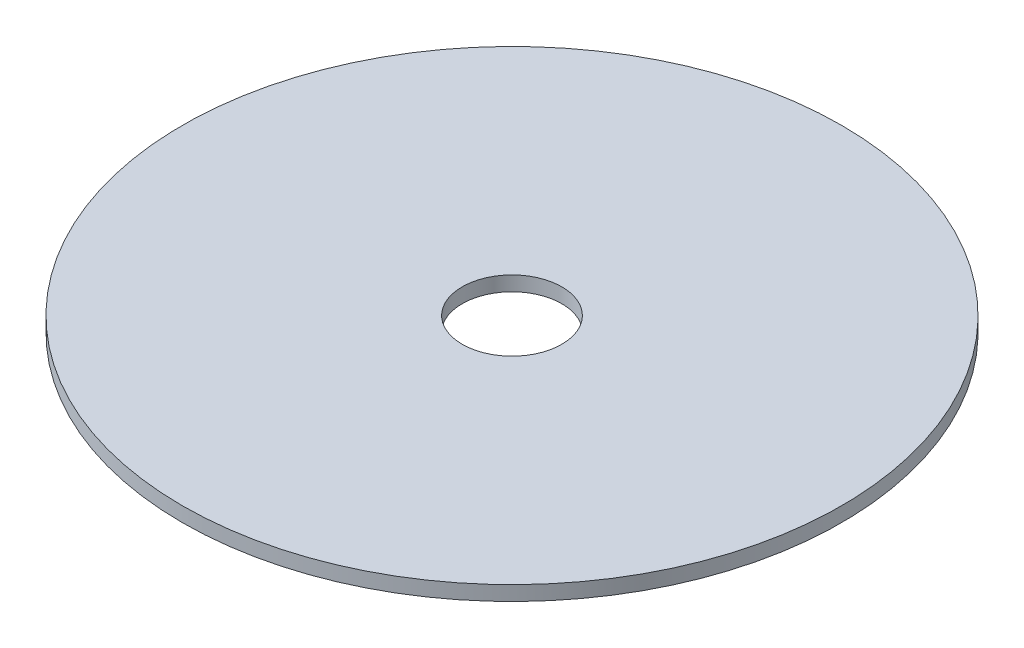
ISO-10303-21;
HEADER;
FILE_DESCRIPTION(('STEP AP214'),'2;1');
FILE_NAME('part.step','',(''),(''),'','','');
FILE_SCHEMA(('AUTOMOTIVE_DESIGN { 1 0 10303 214 1 1 1 1 }'));
ENDSEC;
DATA;
#1=APPLICATION_CONTEXT('core data for automotive mechanical design processes');
#2=APPLICATION_PROTOCOL_DEFINITION('international standard','automotive_design',2000,#1);
#3=PRODUCT_CONTEXT('',#1,'mechanical');
#4=PRODUCT('Part','Part','',(#3));
#5=PRODUCT_RELATED_PRODUCT_CATEGORY('part','',(#4));
#6=PRODUCT_DEFINITION_FORMATION('','',#4);
#7=PRODUCT_DEFINITION_CONTEXT('part definition',#1,'design');
#8=PRODUCT_DEFINITION('design','',#6,#7);
#9=PRODUCT_DEFINITION_SHAPE('','',#8);
#10=(LENGTH_UNIT() NAMED_UNIT(*) SI_UNIT(.MILLI.,.METRE.));
#11=(NAMED_UNIT(*) PLANE_ANGLE_UNIT() SI_UNIT($,.RADIAN.));
#12=(NAMED_UNIT(*) SI_UNIT($,.STERADIAN.) SOLID_ANGLE_UNIT());
#13=UNCERTAINTY_MEASURE_WITH_UNIT(LENGTH_MEASURE(1.E-05),#10,'distance_accuracy_value','');
#14=(GEOMETRIC_REPRESENTATION_CONTEXT(3) GLOBAL_UNCERTAINTY_ASSIGNED_CONTEXT((#13)) GLOBAL_UNIT_ASSIGNED_CONTEXT((#10,
#11,#12)) REPRESENTATION_CONTEXT('',''));
#15=CARTESIAN_POINT('',(0.,0.,0.));
#16=DIRECTION('',(0.,0.,1.));
#17=DIRECTION('',(1.,0.,0.));
#18=AXIS2_PLACEMENT_3D('',#15,#16,#17);
#19=CARTESIAN_POINT('',(0.,1.,0.));
#20=DIRECTION('',(0.,1.,0.));
#21=DIRECTION('',(0.,0.,1.));
#22=AXIS2_PLACEMENT_3D('',#19,#20,#21);
#23=PLANE('',#22);
#24=CARTESIAN_POINT('',(0.,1.,0.));
#25=DIRECTION('',(0.,1.,0.));
#26=DIRECTION('',(0.,0.,1.));
#27=AXIS2_PLACEMENT_3D('',#24,#25,#26);
#28=CIRCLE('',#27,22.5);
#29=CARTESIAN_POINT('',(0.,1.,22.5));
#30=VERTEX_POINT('',#29);
#31=EDGE_CURVE('E10',#30,#30,#28,.T.);
#32=ORIENTED_EDGE('',*,*,#31,.T.);
#33=EDGE_LOOP('',(#32));
#34=FACE_BOUND('',#33,.T.);
#35=CARTESIAN_POINT('',(0.,1.,0.));
#36=DIRECTION('',(0.,1.,0.));
#37=DIRECTION('',(0.,0.,1.));
#38=AXIS2_PLACEMENT_3D('',#35,#36,#37);
#39=CIRCLE('',#38,3.4);
#40=CARTESIAN_POINT('',(0.,1.,3.4));
#41=VERTEX_POINT('',#40);
#42=EDGE_CURVE('E44',#41,#41,#39,.T.);
#43=ORIENTED_EDGE('',*,*,#42,.F.);
#44=EDGE_LOOP('',(#43));
#45=FACE_BOUND('',#44,.T.);
#46=ADVANCED_FACE('F33',(#34,#45),#23,.T.);
#47=CARTESIAN_POINT('',(0.,0.,0.));
#48=DIRECTION('',(0.,1.,0.));
#49=DIRECTION('',(0.,0.,1.));
#50=AXIS2_PLACEMENT_3D('',#47,#48,#49);
#51=PLANE('',#50);
#52=CARTESIAN_POINT('',(0.,0.,0.));
#53=DIRECTION('',(0.,1.,0.));
#54=DIRECTION('',(0.,0.,1.));
#55=AXIS2_PLACEMENT_3D('',#52,#53,#54);
#56=CIRCLE('',#55,22.5);
#57=CARTESIAN_POINT('',(0.,0.,22.5));
#58=VERTEX_POINT('',#57);
#59=EDGE_CURVE('E37',#58,#58,#56,.T.);
#60=ORIENTED_EDGE('',*,*,#59,.F.);
#61=EDGE_LOOP('',(#60));
#62=FACE_BOUND('',#61,.T.);
#63=CARTESIAN_POINT('',(0.,0.,0.));
#64=DIRECTION('',(0.,1.,0.));
#65=DIRECTION('',(0.,0.,1.));
#66=AXIS2_PLACEMENT_3D('',#63,#64,#65);
#67=CIRCLE('',#66,3.4);
#68=CARTESIAN_POINT('',(0.,0.,3.4));
#69=VERTEX_POINT('',#68);
#70=EDGE_CURVE('E46',#69,#69,#67,.T.);
#71=ORIENTED_EDGE('',*,*,#70,.T.);
#72=EDGE_LOOP('',(#71));
#73=FACE_BOUND('',#72,.T.);
#74=ADVANCED_FACE('F56',(#62,#73),#51,.F.);
#75=CARTESIAN_POINT('',(0.,1.,0.));
#76=DIRECTION('',(0.,-1.,0.));
#77=DIRECTION('',(0.,0.,-1.));
#78=AXIS2_PLACEMENT_3D('',#75,#76,#77);
#79=CYLINDRICAL_SURFACE('',#78,22.5);
#80=ORIENTED_EDGE('',*,*,#31,.F.);
#81=EDGE_LOOP('',(#80));
#82=FACE_BOUND('',#81,.T.);
#83=ORIENTED_EDGE('',*,*,#59,.T.);
#84=EDGE_LOOP('',(#83));
#85=FACE_BOUND('',#84,.T.);
#86=ADVANCED_FACE('F35',(#82,#85),#79,.T.);
#87=CARTESIAN_POINT('',(0.,1.,0.));
#88=DIRECTION('',(0.,-1.,0.));
#89=DIRECTION('',(0.,0.,-1.));
#90=AXIS2_PLACEMENT_3D('',#87,#88,#89);
#91=CYLINDRICAL_SURFACE('',#90,3.4);
#92=ORIENTED_EDGE('',*,*,#42,.T.);
#93=EDGE_LOOP('',(#92));
#94=FACE_BOUND('',#93,.T.);
#95=ORIENTED_EDGE('',*,*,#70,.F.);
#96=EDGE_LOOP('',(#95));
#97=FACE_BOUND('',#96,.T.);
#98=ADVANCED_FACE('F52',(#94,#97),#91,.F.);
#99=CLOSED_SHELL('',(#46,#74,#86,#98));
#100=MANIFOLD_SOLID_BREP('B2',#99);
#101=ADVANCED_BREP_SHAPE_REPRESENTATION('',(#18,#100),#14);
#102=SHAPE_DEFINITION_REPRESENTATION(#9,#101);
ENDSEC;
END-ISO-10303-21;
